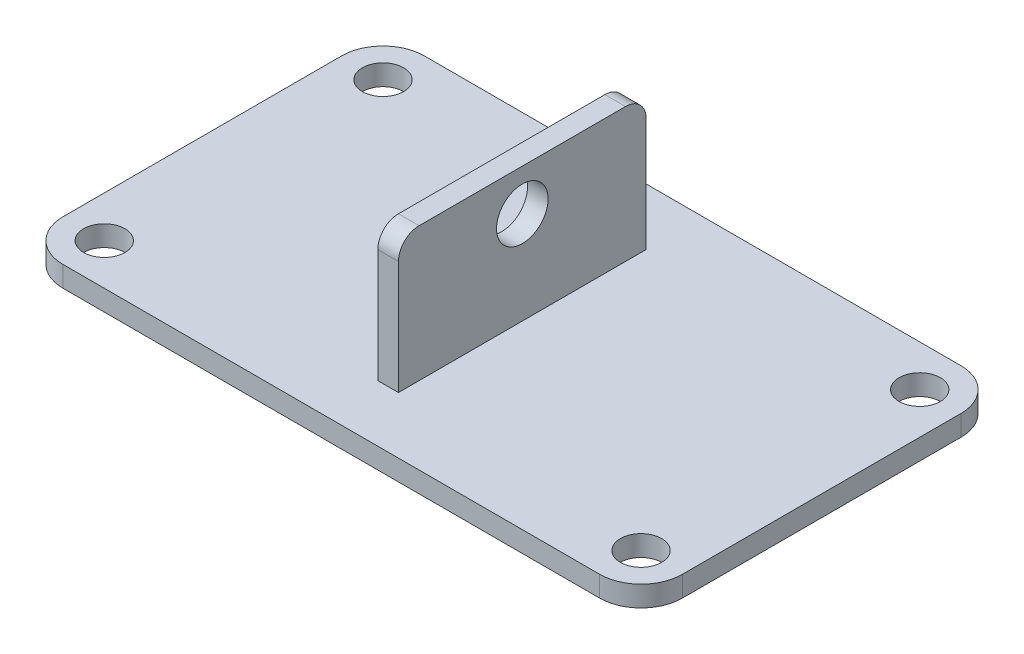
ISO-10303-21;
HEADER;
FILE_DESCRIPTION(('STEP AP214'),'2;1');
FILE_NAME('part.step','',(''),(''),'','','');
FILE_SCHEMA(('AUTOMOTIVE_DESIGN { 1 0 10303 214 1 1 1 1 }'));
ENDSEC;
DATA;
#1=APPLICATION_CONTEXT('core data for automotive mechanical design processes');
#2=APPLICATION_PROTOCOL_DEFINITION('international standard','automotive_design',2000,#1);
#3=PRODUCT_CONTEXT('',#1,'mechanical');
#4=PRODUCT('Part','Part','',(#3));
#5=PRODUCT_RELATED_PRODUCT_CATEGORY('part','',(#4));
#6=PRODUCT_DEFINITION_FORMATION('','',#4);
#7=PRODUCT_DEFINITION_CONTEXT('part definition',#1,'design');
#8=PRODUCT_DEFINITION('design','',#6,#7);
#9=PRODUCT_DEFINITION_SHAPE('','',#8);
#10=(LENGTH_UNIT() NAMED_UNIT(*) SI_UNIT(.MILLI.,.METRE.));
#11=(NAMED_UNIT(*) PLANE_ANGLE_UNIT() SI_UNIT($,.RADIAN.));
#12=(NAMED_UNIT(*) SI_UNIT($,.STERADIAN.) SOLID_ANGLE_UNIT());
#13=UNCERTAINTY_MEASURE_WITH_UNIT(LENGTH_MEASURE(1.E-05),#10,'distance_accuracy_value','');
#14=(GEOMETRIC_REPRESENTATION_CONTEXT(3) GLOBAL_UNCERTAINTY_ASSIGNED_CONTEXT((#13)) GLOBAL_UNIT_ASSIGNED_CONTEXT((#10,
#11,#12)) REPRESENTATION_CONTEXT('',''));
#15=CARTESIAN_POINT('',(0.,0.,0.));
#16=DIRECTION('',(0.,0.,1.));
#17=DIRECTION('',(1.,0.,0.));
#18=AXIS2_PLACEMENT_3D('',#15,#16,#17);
#19=CARTESIAN_POINT('',(5.,65.,-50.));
#20=DIRECTION('',(1.,0.,0.));
#21=DIRECTION('',(0.,0.,-1.));
#22=AXIS2_PLACEMENT_3D('',#19,#20,#21);
#23=PLANE('',#22);
#24=DIRECTION('',(0.,1.,0.));
#25=VECTOR('',#24,1.);
#26=CARTESIAN_POINT('',(5.,10.,-60.));
#27=LINE('',#26,#25);
#28=CARTESIAN_POINT('',(5.,10.,-60.));
#29=VERTEX_POINT('',#28);
#30=CARTESIAN_POINT('',(5.,65.,-60.));
#31=VERTEX_POINT('',#30);
#32=EDGE_CURVE('E153',#29,#31,#27,.T.);
#33=ORIENTED_EDGE('',*,*,#32,.T.);
#34=CARTESIAN_POINT('',(5.,65.,-50.));
#35=DIRECTION('',(1.,0.,0.));
#36=DIRECTION('',(0.,0.,-1.));
#37=AXIS2_PLACEMENT_3D('',#34,#35,#36);
#38=CIRCLE('',#37,10.);
#39=CARTESIAN_POINT('',(5.,75.,-50.));
#40=VERTEX_POINT('',#39);
#41=EDGE_CURVE('E111',#31,#40,#38,.T.);
#42=ORIENTED_EDGE('',*,*,#41,.T.);
#43=DIRECTION('',(0.,0.,1.));
#44=VECTOR('',#43,1.);
#45=CARTESIAN_POINT('',(5.,75.,50.));
#46=LINE('',#45,#44);
#47=CARTESIAN_POINT('',(5.,75.,50.));
#48=VERTEX_POINT('',#47);
#49=EDGE_CURVE('E124',#40,#48,#46,.T.);
#50=ORIENTED_EDGE('',*,*,#49,.T.);
#51=CARTESIAN_POINT('',(5.,65.,50.));
#52=DIRECTION('',(1.,0.,0.));
#53=DIRECTION('',(0.,0.,1.));
#54=AXIS2_PLACEMENT_3D('',#51,#52,#53);
#55=CIRCLE('',#54,10.);
#56=CARTESIAN_POINT('',(5.,65.,60.));
#57=VERTEX_POINT('',#56);
#58=EDGE_CURVE('E118',#48,#57,#55,.T.);
#59=ORIENTED_EDGE('',*,*,#58,.T.);
#60=DIRECTION('',(0.,-1.,0.));
#61=VECTOR('',#60,1.);
#62=CARTESIAN_POINT('',(5.,10.,60.));
#63=LINE('',#62,#61);
#64=CARTESIAN_POINT('',(5.,10.,60.));
#65=VERTEX_POINT('',#64);
#66=EDGE_CURVE('E122',#57,#65,#63,.T.);
#67=ORIENTED_EDGE('',*,*,#66,.T.);
#68=DIRECTION('',(0.,0.,-1.));
#69=VECTOR('',#68,1.);
#70=CARTESIAN_POINT('',(5.,10.,60.));
#71=LINE('',#70,#69);
#72=EDGE_CURVE('E74',#65,#29,#71,.T.);
#73=ORIENTED_EDGE('',*,*,#72,.T.);
#74=EDGE_LOOP('',(#33,#42,#50,#59,#67,#73));
#75=FACE_BOUND('',#74,.T.);
#76=CARTESIAN_POINT('',(5.,55.,0.));
#77=DIRECTION('',(1.,0.,0.));
#78=DIRECTION('',(0.,0.,-1.));
#79=AXIS2_PLACEMENT_3D('',#76,#77,#78);
#80=CIRCLE('',#79,12.5);
#81=CARTESIAN_POINT('',(5.,55.,-12.5));
#82=VERTEX_POINT('',#81);
#83=EDGE_CURVE('E146',#82,#82,#80,.T.);
#84=ORIENTED_EDGE('',*,*,#83,.F.);
#85=EDGE_LOOP('',(#84));
#86=FACE_BOUND('',#85,.T.);
#87=ADVANCED_FACE('F57',(#75,#86),#23,.T.);
#88=CARTESIAN_POINT('',(-5.,65.,-50.));
#89=DIRECTION('',(1.,0.,0.));
#90=DIRECTION('',(0.,0.,-1.));
#91=AXIS2_PLACEMENT_3D('',#88,#89,#90);
#92=PLANE('',#91);
#93=DIRECTION('',(0.,1.,0.));
#94=VECTOR('',#93,1.);
#95=CARTESIAN_POINT('',(-5.,10.,-60.));
#96=LINE('',#95,#94);
#97=CARTESIAN_POINT('',(-5.,10.,-60.));
#98=VERTEX_POINT('',#97);
#99=CARTESIAN_POINT('',(-5.,65.,-60.));
#100=VERTEX_POINT('',#99);
#101=EDGE_CURVE('E142',#98,#100,#96,.T.);
#102=ORIENTED_EDGE('',*,*,#101,.F.);
#103=DIRECTION('',(0.,0.,-1.));
#104=VECTOR('',#103,1.);
#105=CARTESIAN_POINT('',(-5.,10.,60.));
#106=LINE('',#105,#104);
#107=CARTESIAN_POINT('',(-5.,10.,60.));
#108=VERTEX_POINT('',#107);
#109=EDGE_CURVE('E103',#108,#98,#106,.T.);
#110=ORIENTED_EDGE('',*,*,#109,.F.);
#111=DIRECTION('',(0.,-1.,0.));
#112=VECTOR('',#111,1.);
#113=CARTESIAN_POINT('',(-5.,10.,60.));
#114=LINE('',#113,#112);
#115=CARTESIAN_POINT('',(-5.,65.,60.));
#116=VERTEX_POINT('',#115);
#117=EDGE_CURVE('E97',#116,#108,#114,.T.);
#118=ORIENTED_EDGE('',*,*,#117,.F.);
#119=CARTESIAN_POINT('',(-5.,65.,50.));
#120=DIRECTION('',(1.,0.,0.));
#121=DIRECTION('',(0.,0.,1.));
#122=AXIS2_PLACEMENT_3D('',#119,#120,#121);
#123=CIRCLE('',#122,10.);
#124=CARTESIAN_POINT('',(-5.,75.,50.));
#125=VERTEX_POINT('',#124);
#126=EDGE_CURVE('E132',#125,#116,#123,.T.);
#127=ORIENTED_EDGE('',*,*,#126,.F.);
#128=DIRECTION('',(0.,0.,1.));
#129=VECTOR('',#128,1.);
#130=CARTESIAN_POINT('',(-5.,75.,50.));
#131=LINE('',#130,#129);
#132=CARTESIAN_POINT('',(-5.,75.,-50.));
#133=VERTEX_POINT('',#132);
#134=EDGE_CURVE('E148',#133,#125,#131,.T.);
#135=ORIENTED_EDGE('',*,*,#134,.F.);
#136=CARTESIAN_POINT('',(-5.,65.,-50.));
#137=DIRECTION('',(1.,0.,0.));
#138=DIRECTION('',(0.,0.,-1.));
#139=AXIS2_PLACEMENT_3D('',#136,#137,#138);
#140=CIRCLE('',#139,10.);
#141=EDGE_CURVE('E145',#100,#133,#140,.T.);
#142=ORIENTED_EDGE('',*,*,#141,.F.);
#143=EDGE_LOOP('',(#102,#110,#118,#127,#135,#142));
#144=FACE_BOUND('',#143,.T.);
#145=CARTESIAN_POINT('',(-5.,55.,0.));
#146=DIRECTION('',(1.,0.,0.));
#147=DIRECTION('',(0.,0.,-1.));
#148=AXIS2_PLACEMENT_3D('',#145,#146,#147);
#149=CIRCLE('',#148,12.5);
#150=CARTESIAN_POINT('',(-5.,55.,-12.5));
#151=VERTEX_POINT('',#150);
#152=EDGE_CURVE('E246',#151,#151,#149,.T.);
#153=ORIENTED_EDGE('',*,*,#152,.T.);
#154=EDGE_LOOP('',(#153));
#155=FACE_BOUND('',#154,.T.);
#156=ADVANCED_FACE('F162',(#144,#155),#92,.F.);
#157=CARTESIAN_POINT('',(5.,10.,-60.));
#158=DIRECTION('',(0.,0.,1.));
#159=DIRECTION('',(1.,0.,0.));
#160=AXIS2_PLACEMENT_3D('',#157,#158,#159);
#161=PLANE('',#160);
#162=ORIENTED_EDGE('',*,*,#101,.T.);
#163=DIRECTION('',(-1.,0.,0.));
#164=VECTOR('',#163,1.);
#165=CARTESIAN_POINT('',(5.,65.,-60.));
#166=LINE('',#165,#164);
#167=EDGE_CURVE('E12',#31,#100,#166,.T.);
#168=ORIENTED_EDGE('',*,*,#167,.F.);
#169=ORIENTED_EDGE('',*,*,#32,.F.);
#170=DIRECTION('',(-1.,0.,0.));
#171=VECTOR('',#170,1.);
#172=CARTESIAN_POINT('',(5.,10.,-60.));
#173=LINE('',#172,#171);
#174=EDGE_CURVE('E138',#29,#98,#173,.T.);
#175=ORIENTED_EDGE('',*,*,#174,.T.);
#176=EDGE_LOOP('',(#162,#168,#169,#175));
#177=FACE_BOUND('',#176,.T.);
#178=ADVANCED_FACE('F59',(#177),#161,.F.);
#179=CARTESIAN_POINT('',(5.,65.,-50.));
#180=DIRECTION('',(-1.,0.,0.));
#181=DIRECTION('',(0.,0.,1.));
#182=AXIS2_PLACEMENT_3D('',#179,#180,#181);
#183=CYLINDRICAL_SURFACE('',#182,10.);
#184=ORIENTED_EDGE('',*,*,#141,.T.);
#185=DIRECTION('',(-1.,0.,0.));
#186=VECTOR('',#185,1.);
#187=CARTESIAN_POINT('',(5.,75.,-50.));
#188=LINE('',#187,#186);
#189=EDGE_CURVE('E66',#40,#133,#188,.T.);
#190=ORIENTED_EDGE('',*,*,#189,.F.);
#191=ORIENTED_EDGE('',*,*,#41,.F.);
#192=ORIENTED_EDGE('',*,*,#167,.T.);
#193=EDGE_LOOP('',(#184,#190,#191,#192));
#194=FACE_BOUND('',#193,.T.);
#195=ADVANCED_FACE('F187',(#194),#183,.T.);
#196=CARTESIAN_POINT('',(5.,75.,50.));
#197=DIRECTION('',(0.,-1.,0.));
#198=DIRECTION('',(0.,0.,-1.));
#199=AXIS2_PLACEMENT_3D('',#196,#197,#198);
#200=PLANE('',#199);
#201=ORIENTED_EDGE('',*,*,#134,.T.);
#202=DIRECTION('',(-1.,0.,0.));
#203=VECTOR('',#202,1.);
#204=CARTESIAN_POINT('',(5.,75.,50.));
#205=LINE('',#204,#203);
#206=EDGE_CURVE('E133',#48,#125,#205,.T.);
#207=ORIENTED_EDGE('',*,*,#206,.F.);
#208=ORIENTED_EDGE('',*,*,#49,.F.);
#209=ORIENTED_EDGE('',*,*,#189,.T.);
#210=EDGE_LOOP('',(#201,#207,#208,#209));
#211=FACE_BOUND('',#210,.T.);
#212=ADVANCED_FACE('F159',(#211),#200,.F.);
#213=CARTESIAN_POINT('',(5.,65.,50.));
#214=DIRECTION('',(-1.,0.,0.));
#215=DIRECTION('',(0.,0.,1.));
#216=AXIS2_PLACEMENT_3D('',#213,#214,#215);
#217=CYLINDRICAL_SURFACE('',#216,10.);
#218=ORIENTED_EDGE('',*,*,#126,.T.);
#219=DIRECTION('',(-1.,0.,0.));
#220=VECTOR('',#219,1.);
#221=CARTESIAN_POINT('',(5.,65.,60.));
#222=LINE('',#221,#220);
#223=EDGE_CURVE('E129',#57,#116,#222,.T.);
#224=ORIENTED_EDGE('',*,*,#223,.F.);
#225=ORIENTED_EDGE('',*,*,#58,.F.);
#226=ORIENTED_EDGE('',*,*,#206,.T.);
#227=EDGE_LOOP('',(#218,#224,#225,#226));
#228=FACE_BOUND('',#227,.T.);
#229=ADVANCED_FACE('F130',(#228),#217,.T.);
#230=CARTESIAN_POINT('',(5.,10.,60.));
#231=DIRECTION('',(0.,0.,-1.));
#232=DIRECTION('',(-1.,0.,0.));
#233=AXIS2_PLACEMENT_3D('',#230,#231,#232);
#234=PLANE('',#233);
#235=ORIENTED_EDGE('',*,*,#117,.T.);
#236=DIRECTION('',(-1.,0.,0.));
#237=VECTOR('',#236,1.);
#238=CARTESIAN_POINT('',(5.,10.,60.));
#239=LINE('',#238,#237);
#240=EDGE_CURVE('E134',#65,#108,#239,.T.);
#241=ORIENTED_EDGE('',*,*,#240,.F.);
#242=ORIENTED_EDGE('',*,*,#66,.F.);
#243=ORIENTED_EDGE('',*,*,#223,.T.);
#244=EDGE_LOOP('',(#235,#241,#242,#243));
#245=FACE_BOUND('',#244,.T.);
#246=ADVANCED_FACE('F136',(#245),#234,.F.);
#247=CARTESIAN_POINT('',(5.,10.,60.));
#248=DIRECTION('',(0.,1.,0.));
#249=DIRECTION('',(0.,0.,1.));
#250=AXIS2_PLACEMENT_3D('',#247,#248,#249);
#251=PLANE('',#250);
#252=ORIENTED_EDGE('',*,*,#109,.T.);
#253=ORIENTED_EDGE('',*,*,#174,.F.);
#254=ORIENTED_EDGE('',*,*,#72,.F.);
#255=ORIENTED_EDGE('',*,*,#240,.T.);
#256=EDGE_LOOP('',(#252,#253,#254,#255));
#257=FACE_BOUND('',#256,.T.);
#258=ADVANCED_FACE('F167',(#257),#251,.F.);
#259=CARTESIAN_POINT('',(5.,55.,0.));
#260=DIRECTION('',(-1.,0.,0.));
#261=DIRECTION('',(0.,0.,1.));
#262=AXIS2_PLACEMENT_3D('',#259,#260,#261);
#263=CYLINDRICAL_SURFACE('',#262,12.5);
#264=ORIENTED_EDGE('',*,*,#83,.T.);
#265=EDGE_LOOP('',(#264));
#266=FACE_BOUND('',#265,.T.);
#267=ORIENTED_EDGE('',*,*,#152,.F.);
#268=EDGE_LOOP('',(#267));
#269=FACE_BOUND('',#268,.T.);
#270=ADVANCED_FACE('F169',(#266,#269),#263,.F.);
#271=CLOSED_SHELL('',(#87,#156,#178,#195,#212,#229,#246,#258,#270));
#272=MANIFOLD_SOLID_BREP('B2',#271);
#273=CARTESIAN_POINT('',(130.,10.,-67.5));
#274=DIRECTION('',(0.,1.,0.));
#275=DIRECTION('',(0.,0.,1.));
#276=AXIS2_PLACEMENT_3D('',#273,#274,#275);
#277=PLANE('',#276);
#278=CARTESIAN_POINT('',(130.,10.,-67.5));
#279=DIRECTION('',(0.,1.,0.));
#280=DIRECTION('',(0.,0.,-1.));
#281=AXIS2_PLACEMENT_3D('',#278,#279,#280);
#282=CIRCLE('',#281,9.99999999999998);
#283=CARTESIAN_POINT('',(130.,10.,-77.5));
#284=VERTEX_POINT('',#283);
#285=EDGE_CURVE('E436',#284,#284,#282,.T.);
#286=ORIENTED_EDGE('',*,*,#285,.F.);
#287=EDGE_LOOP('',(#286));
#288=FACE_BOUND('',#287,.T.);
#289=CARTESIAN_POINT('',(-130.,10.,-67.5));
#290=DIRECTION('',(0.,1.,0.));
#291=DIRECTION('',(0.,0.,1.));
#292=AXIS2_PLACEMENT_3D('',#289,#290,#291);
#293=CIRCLE('',#292,9.99999999999999);
#294=CARTESIAN_POINT('',(-130.,10.,-57.5));
#295=VERTEX_POINT('',#294);
#296=EDGE_CURVE('E361',#295,#295,#293,.T.);
#297=ORIENTED_EDGE('',*,*,#296,.F.);
#298=EDGE_LOOP('',(#297));
#299=FACE_BOUND('',#298,.T.);
#300=CARTESIAN_POINT('',(130.,10.,-67.5));
#301=DIRECTION('',(0.,1.,0.));
#302=DIRECTION('',(0.,0.,1.));
#303=AXIS2_PLACEMENT_3D('',#300,#301,#302);
#304=CIRCLE('',#303,20.);
#305=CARTESIAN_POINT('',(150.,10.,-67.5));
#306=VERTEX_POINT('',#305);
#307=CARTESIAN_POINT('',(130.,10.,-87.5));
#308=VERTEX_POINT('',#307);
#309=EDGE_CURVE('E379',#306,#308,#304,.T.);
#310=ORIENTED_EDGE('',*,*,#309,.T.);
#311=DIRECTION('',(-1.,0.,0.));
#312=VECTOR('',#311,1.);
#313=CARTESIAN_POINT('',(-130.,10.,-87.5));
#314=LINE('',#313,#312);
#315=CARTESIAN_POINT('',(-130.,10.,-87.5));
#316=VERTEX_POINT('',#315);
#317=EDGE_CURVE('E315',#308,#316,#314,.T.);
#318=ORIENTED_EDGE('',*,*,#317,.T.);
#319=CARTESIAN_POINT('',(-130.,10.,-67.5));
#320=DIRECTION('',(0.,1.,0.));
#321=DIRECTION('',(0.,0.,-1.));
#322=AXIS2_PLACEMENT_3D('',#319,#320,#321);
#323=CIRCLE('',#322,20.);
#324=CARTESIAN_POINT('',(-150.,10.,-67.5));
#325=VERTEX_POINT('',#324);
#326=EDGE_CURVE('E400',#316,#325,#323,.T.);
#327=ORIENTED_EDGE('',*,*,#326,.T.);
#328=DIRECTION('',(0.,0.,1.));
#329=VECTOR('',#328,1.);
#330=CARTESIAN_POINT('',(-150.,10.,67.5));
#331=LINE('',#330,#329);
#332=CARTESIAN_POINT('',(-150.,10.,67.5));
#333=VERTEX_POINT('',#332);
#334=EDGE_CURVE('E414',#325,#333,#331,.T.);
#335=ORIENTED_EDGE('',*,*,#334,.T.);
#336=CARTESIAN_POINT('',(-130.,10.,67.5));
#337=DIRECTION('',(0.,1.,0.));
#338=DIRECTION('',(0.,0.,-1.));
#339=AXIS2_PLACEMENT_3D('',#336,#337,#338);
#340=CIRCLE('',#339,20.);
#341=CARTESIAN_POINT('',(-130.,10.,87.5));
#342=VERTEX_POINT('',#341);
#343=EDGE_CURVE('E334',#333,#342,#340,.T.);
#344=ORIENTED_EDGE('',*,*,#343,.T.);
#345=DIRECTION('',(1.,0.,0.));
#346=VECTOR('',#345,1.);
#347=CARTESIAN_POINT('',(-130.,10.,87.5));
#348=LINE('',#347,#346);
#349=CARTESIAN_POINT('',(130.,10.,87.5));
#350=VERTEX_POINT('',#349);
#351=EDGE_CURVE('E328',#342,#350,#348,.T.);
#352=ORIENTED_EDGE('',*,*,#351,.T.);
#353=CARTESIAN_POINT('',(130.,10.,67.5));
#354=DIRECTION('',(0.,1.,0.));
#355=DIRECTION('',(0.,0.,-1.));
#356=AXIS2_PLACEMENT_3D('',#353,#354,#355);
#357=CIRCLE('',#356,20.);
#358=CARTESIAN_POINT('',(150.,10.,67.5));
#359=VERTEX_POINT('',#358);
#360=EDGE_CURVE('E332',#350,#359,#357,.T.);
#361=ORIENTED_EDGE('',*,*,#360,.T.);
#362=DIRECTION('',(0.,0.,-1.));
#363=VECTOR('',#362,1.);
#364=CARTESIAN_POINT('',(150.,10.,67.5));
#365=LINE('',#364,#363);
#366=EDGE_CURVE('E272',#359,#306,#365,.T.);
#367=ORIENTED_EDGE('',*,*,#366,.T.);
#368=EDGE_LOOP('',(#310,#318,#327,#335,#344,#352,#361,#367));
#369=FACE_BOUND('',#368,.T.);
#370=CARTESIAN_POINT('',(-130.,10.,67.5));
#371=DIRECTION('',(0.,1.,0.));
#372=DIRECTION('',(0.,0.,-1.));
#373=AXIS2_PLACEMENT_3D('',#370,#371,#372);
#374=CIRCLE('',#373,9.99999999999999);
#375=CARTESIAN_POINT('',(-130.,10.,57.5));
#376=VERTEX_POINT('',#375);
#377=EDGE_CURVE('E428',#376,#376,#374,.T.);
#378=ORIENTED_EDGE('',*,*,#377,.F.);
#379=EDGE_LOOP('',(#378));
#380=FACE_BOUND('',#379,.T.);
#381=CARTESIAN_POINT('',(130.,10.,67.5));
#382=DIRECTION('',(0.,1.,0.));
#383=DIRECTION('',(0.,0.,1.));
#384=AXIS2_PLACEMENT_3D('',#381,#382,#383);
#385=CIRCLE('',#384,9.99999999999998);
#386=CARTESIAN_POINT('',(130.,10.,77.5));
#387=VERTEX_POINT('',#386);
#388=EDGE_CURVE('E444',#387,#387,#385,.T.);
#389=ORIENTED_EDGE('',*,*,#388,.F.);
#390=EDGE_LOOP('',(#389));
#391=FACE_BOUND('',#390,.T.);
#392=ADVANCED_FACE('F254',(#288,#299,#369,#380,#391),#277,.T.);
#393=CARTESIAN_POINT('',(130.,0.,-67.5));
#394=DIRECTION('',(0.,1.,0.));
#395=DIRECTION('',(0.,0.,1.));
#396=AXIS2_PLACEMENT_3D('',#393,#394,#395);
#397=PLANE('',#396);
#398=CARTESIAN_POINT('',(130.,0.,-67.5));
#399=DIRECTION('',(0.,1.,0.));
#400=DIRECTION('',(0.,0.,1.));
#401=AXIS2_PLACEMENT_3D('',#398,#399,#400);
#402=CIRCLE('',#401,20.);
#403=CARTESIAN_POINT('',(150.,0.,-67.5));
#404=VERTEX_POINT('',#403);
#405=CARTESIAN_POINT('',(130.,0.,-87.5));
#406=VERTEX_POINT('',#405);
#407=EDGE_CURVE('E356',#404,#406,#402,.T.);
#408=ORIENTED_EDGE('',*,*,#407,.F.);
#409=DIRECTION('',(0.,0.,-1.));
#410=VECTOR('',#409,1.);
#411=CARTESIAN_POINT('',(150.,0.,67.5));
#412=LINE('',#411,#410);
#413=CARTESIAN_POINT('',(150.,0.,67.5));
#414=VERTEX_POINT('',#413);
#415=EDGE_CURVE('E307',#414,#404,#412,.T.);
#416=ORIENTED_EDGE('',*,*,#415,.F.);
#417=CARTESIAN_POINT('',(130.,0.,67.5));
#418=DIRECTION('',(0.,1.,0.));
#419=DIRECTION('',(0.,0.,-1.));
#420=AXIS2_PLACEMENT_3D('',#417,#418,#419);
#421=CIRCLE('',#420,20.);
#422=CARTESIAN_POINT('',(130.,0.,87.5));
#423=VERTEX_POINT('',#422);
#424=EDGE_CURVE('E301',#423,#414,#421,.T.);
#425=ORIENTED_EDGE('',*,*,#424,.F.);
#426=DIRECTION('',(1.,0.,0.));
#427=VECTOR('',#426,1.);
#428=CARTESIAN_POINT('',(-130.,0.,87.5));
#429=LINE('',#428,#427);
#430=CARTESIAN_POINT('',(-130.,0.,87.5));
#431=VERTEX_POINT('',#430);
#432=EDGE_CURVE('E343',#431,#423,#429,.T.);
#433=ORIENTED_EDGE('',*,*,#432,.F.);
#434=CARTESIAN_POINT('',(-130.,0.,67.5));
#435=DIRECTION('',(0.,1.,0.));
#436=DIRECTION('',(0.,0.,-1.));
#437=AXIS2_PLACEMENT_3D('',#434,#435,#436);
#438=CIRCLE('',#437,20.);
#439=CARTESIAN_POINT('',(-150.,0.,67.5));
#440=VERTEX_POINT('',#439);
#441=EDGE_CURVE('E370',#440,#431,#438,.T.);
#442=ORIENTED_EDGE('',*,*,#441,.F.);
#443=DIRECTION('',(0.,0.,1.));
#444=VECTOR('',#443,1.);
#445=CARTESIAN_POINT('',(-150.,0.,67.5));
#446=LINE('',#445,#444);
#447=CARTESIAN_POINT('',(-150.,0.,-67.5));
#448=VERTEX_POINT('',#447);
#449=EDGE_CURVE('E367',#448,#440,#446,.T.);
#450=ORIENTED_EDGE('',*,*,#449,.F.);
#451=CARTESIAN_POINT('',(-130.,0.,-67.5));
#452=DIRECTION('',(0.,1.,0.));
#453=DIRECTION('',(0.,0.,-1.));
#454=AXIS2_PLACEMENT_3D('',#451,#452,#453);
#455=CIRCLE('',#454,20.);
#456=CARTESIAN_POINT('',(-130.,0.,-87.5));
#457=VERTEX_POINT('',#456);
#458=EDGE_CURVE('E364',#457,#448,#455,.T.);
#459=ORIENTED_EDGE('',*,*,#458,.F.);
#460=DIRECTION('',(-1.,0.,0.));
#461=VECTOR('',#460,1.);
#462=CARTESIAN_POINT('',(-130.,0.,-87.5));
#463=LINE('',#462,#461);
#464=EDGE_CURVE('E360',#406,#457,#463,.T.);
#465=ORIENTED_EDGE('',*,*,#464,.F.);
#466=EDGE_LOOP('',(#408,#416,#425,#433,#442,#450,#459,#465));
#467=FACE_BOUND('',#466,.T.);
#468=CARTESIAN_POINT('',(-130.,0.,-67.5));
#469=DIRECTION('',(0.,1.,0.));
#470=DIRECTION('',(0.,0.,1.));
#471=AXIS2_PLACEMENT_3D('',#468,#469,#470);
#472=CIRCLE('',#471,9.99999999999999);
#473=CARTESIAN_POINT('',(-130.,0.,-57.5));
#474=VERTEX_POINT('',#473);
#475=EDGE_CURVE('E424',#474,#474,#472,.T.);
#476=ORIENTED_EDGE('',*,*,#475,.T.);
#477=EDGE_LOOP('',(#476));
#478=FACE_BOUND('',#477,.T.);
#479=CARTESIAN_POINT('',(-130.,0.,67.5));
#480=DIRECTION('',(0.,1.,0.));
#481=DIRECTION('',(0.,0.,-1.));
#482=AXIS2_PLACEMENT_3D('',#479,#480,#481);
#483=CIRCLE('',#482,9.99999999999999);
#484=CARTESIAN_POINT('',(-130.,0.,57.5));
#485=VERTEX_POINT('',#484);
#486=EDGE_CURVE('E432',#485,#485,#483,.T.);
#487=ORIENTED_EDGE('',*,*,#486,.T.);
#488=EDGE_LOOP('',(#487));
#489=FACE_BOUND('',#488,.T.);
#490=CARTESIAN_POINT('',(130.,0.,-67.5));
#491=DIRECTION('',(0.,1.,0.));
#492=DIRECTION('',(0.,0.,-1.));
#493=AXIS2_PLACEMENT_3D('',#490,#491,#492);
#494=CIRCLE('',#493,9.99999999999998);
#495=CARTESIAN_POINT('',(130.,0.,-77.5));
#496=VERTEX_POINT('',#495);
#497=EDGE_CURVE('E440',#496,#496,#494,.T.);
#498=ORIENTED_EDGE('',*,*,#497,.T.);
#499=EDGE_LOOP('',(#498));
#500=FACE_BOUND('',#499,.T.);
#501=CARTESIAN_POINT('',(130.,0.,67.5));
#502=DIRECTION('',(0.,1.,0.));
#503=DIRECTION('',(0.,0.,1.));
#504=AXIS2_PLACEMENT_3D('',#501,#502,#503);
#505=CIRCLE('',#504,9.99999999999998);
#506=CARTESIAN_POINT('',(130.,0.,77.5));
#507=VERTEX_POINT('',#506);
#508=EDGE_CURVE('E448',#507,#507,#505,.T.);
#509=ORIENTED_EDGE('',*,*,#508,.T.);
#510=EDGE_LOOP('',(#509));
#511=FACE_BOUND('',#510,.T.);
#512=ADVANCED_FACE('F404',(#467,#478,#489,#500,#511),#397,.F.);
#513=CARTESIAN_POINT('',(130.,10.,-67.5));
#514=DIRECTION('',(0.,-1.,0.));
#515=DIRECTION('',(0.,0.,-1.));
#516=AXIS2_PLACEMENT_3D('',#513,#514,#515);
#517=CYLINDRICAL_SURFACE('',#516,20.);
#518=ORIENTED_EDGE('',*,*,#407,.T.);
#519=DIRECTION('',(0.,-1.,0.));
#520=VECTOR('',#519,1.);
#521=CARTESIAN_POINT('',(130.,10.,-87.5));
#522=LINE('',#521,#520);
#523=EDGE_CURVE('E55',#308,#406,#522,.T.);
#524=ORIENTED_EDGE('',*,*,#523,.F.);
#525=ORIENTED_EDGE('',*,*,#309,.F.);
#526=DIRECTION('',(0.,-1.,0.));
#527=VECTOR('',#526,1.);
#528=CARTESIAN_POINT('',(150.,10.,-67.5));
#529=LINE('',#528,#527);
#530=EDGE_CURVE('E352',#306,#404,#529,.T.);
#531=ORIENTED_EDGE('',*,*,#530,.T.);
#532=EDGE_LOOP('',(#518,#524,#525,#531));
#533=FACE_BOUND('',#532,.T.);
#534=ADVANCED_FACE('F256',(#533),#517,.T.);
#535=CARTESIAN_POINT('',(-130.,10.,-87.5));
#536=DIRECTION('',(0.,0.,1.));
#537=DIRECTION('',(1.,0.,0.));
#538=AXIS2_PLACEMENT_3D('',#535,#536,#537);
#539=PLANE('',#538);
#540=ORIENTED_EDGE('',*,*,#464,.T.);
#541=DIRECTION('',(0.,-1.,0.));
#542=VECTOR('',#541,1.);
#543=CARTESIAN_POINT('',(-130.,10.,-87.5));
#544=LINE('',#543,#542);
#545=EDGE_CURVE('E264',#316,#457,#544,.T.);
#546=ORIENTED_EDGE('',*,*,#545,.F.);
#547=ORIENTED_EDGE('',*,*,#317,.F.);
#548=ORIENTED_EDGE('',*,*,#523,.T.);
#549=EDGE_LOOP('',(#540,#546,#547,#548));
#550=FACE_BOUND('',#549,.T.);
#551=ADVANCED_FACE('F484',(#550),#539,.F.);
#552=CARTESIAN_POINT('',(-130.,10.,-67.5));
#553=DIRECTION('',(0.,-1.,0.));
#554=DIRECTION('',(0.,0.,-1.));
#555=AXIS2_PLACEMENT_3D('',#552,#553,#554);
#556=CYLINDRICAL_SURFACE('',#555,20.);
#557=ORIENTED_EDGE('',*,*,#458,.T.);
#558=DIRECTION('',(0.,-1.,0.));
#559=VECTOR('',#558,1.);
#560=CARTESIAN_POINT('',(-150.,10.,-67.5));
#561=LINE('',#560,#559);
#562=EDGE_CURVE('E390',#325,#448,#561,.T.);
#563=ORIENTED_EDGE('',*,*,#562,.F.);
#564=ORIENTED_EDGE('',*,*,#326,.F.);
#565=ORIENTED_EDGE('',*,*,#545,.T.);
#566=EDGE_LOOP('',(#557,#563,#564,#565));
#567=FACE_BOUND('',#566,.T.);
#568=ADVANCED_FACE('F398',(#567),#556,.T.);
#569=CARTESIAN_POINT('',(-150.,10.,67.5));
#570=DIRECTION('',(1.,0.,0.));
#571=DIRECTION('',(0.,0.,-1.));
#572=AXIS2_PLACEMENT_3D('',#569,#570,#571);
#573=PLANE('',#572);
#574=ORIENTED_EDGE('',*,*,#449,.T.);
#575=DIRECTION('',(0.,-1.,0.));
#576=VECTOR('',#575,1.);
#577=CARTESIAN_POINT('',(-150.,10.,67.5));
#578=LINE('',#577,#576);
#579=EDGE_CURVE('E386',#333,#440,#578,.T.);
#580=ORIENTED_EDGE('',*,*,#579,.F.);
#581=ORIENTED_EDGE('',*,*,#334,.F.);
#582=ORIENTED_EDGE('',*,*,#562,.T.);
#583=EDGE_LOOP('',(#574,#580,#581,#582));
#584=FACE_BOUND('',#583,.T.);
#585=ADVANCED_FACE('F409',(#584),#573,.F.);
#586=CARTESIAN_POINT('',(-130.,10.,67.5));
#587=DIRECTION('',(0.,-1.,0.));
#588=DIRECTION('',(0.,0.,-1.));
#589=AXIS2_PLACEMENT_3D('',#586,#587,#588);
#590=CYLINDRICAL_SURFACE('',#589,20.);
#591=ORIENTED_EDGE('',*,*,#441,.T.);
#592=DIRECTION('',(0.,-1.,0.));
#593=VECTOR('',#592,1.);
#594=CARTESIAN_POINT('',(-130.,10.,87.5));
#595=LINE('',#594,#593);
#596=EDGE_CURVE('E345',#342,#431,#595,.T.);
#597=ORIENTED_EDGE('',*,*,#596,.F.);
#598=ORIENTED_EDGE('',*,*,#343,.F.);
#599=ORIENTED_EDGE('',*,*,#579,.T.);
#600=EDGE_LOOP('',(#591,#597,#598,#599));
#601=FACE_BOUND('',#600,.T.);
#602=ADVANCED_FACE('F412',(#601),#590,.T.);
#603=CARTESIAN_POINT('',(-130.,10.,87.5));
#604=DIRECTION('',(0.,0.,-1.));
#605=DIRECTION('',(-1.,0.,0.));
#606=AXIS2_PLACEMENT_3D('',#603,#604,#605);
#607=PLANE('',#606);
#608=ORIENTED_EDGE('',*,*,#432,.T.);
#609=DIRECTION('',(0.,-1.,0.));
#610=VECTOR('',#609,1.);
#611=CARTESIAN_POINT('',(130.,10.,87.5));
#612=LINE('',#611,#610);
#613=EDGE_CURVE('E340',#350,#423,#612,.T.);
#614=ORIENTED_EDGE('',*,*,#613,.F.);
#615=ORIENTED_EDGE('',*,*,#351,.F.);
#616=ORIENTED_EDGE('',*,*,#596,.T.);
#617=EDGE_LOOP('',(#608,#614,#615,#616));
#618=FACE_BOUND('',#617,.T.);
#619=ADVANCED_FACE('F341',(#618),#607,.F.);
#620=CARTESIAN_POINT('',(130.,10.,67.5));
#621=DIRECTION('',(0.,-1.,0.));
#622=DIRECTION('',(0.,0.,-1.));
#623=AXIS2_PLACEMENT_3D('',#620,#621,#622);
#624=CYLINDRICAL_SURFACE('',#623,20.);
#625=ORIENTED_EDGE('',*,*,#424,.T.);
#626=DIRECTION('',(0.,-1.,0.));
#627=VECTOR('',#626,1.);
#628=CARTESIAN_POINT('',(150.,10.,67.5));
#629=LINE('',#628,#627);
#630=EDGE_CURVE('E346',#359,#414,#629,.T.);
#631=ORIENTED_EDGE('',*,*,#630,.F.);
#632=ORIENTED_EDGE('',*,*,#360,.F.);
#633=ORIENTED_EDGE('',*,*,#613,.T.);
#634=EDGE_LOOP('',(#625,#631,#632,#633));
#635=FACE_BOUND('',#634,.T.);
#636=ADVANCED_FACE('F348',(#635),#624,.T.);
#637=CARTESIAN_POINT('',(150.,10.,67.5));
#638=DIRECTION('',(-1.,0.,0.));
#639=DIRECTION('',(0.,0.,1.));
#640=AXIS2_PLACEMENT_3D('',#637,#638,#639);
#641=PLANE('',#640);
#642=ORIENTED_EDGE('',*,*,#415,.T.);
#643=ORIENTED_EDGE('',*,*,#530,.F.);
#644=ORIENTED_EDGE('',*,*,#366,.F.);
#645=ORIENTED_EDGE('',*,*,#630,.T.);
#646=EDGE_LOOP('',(#642,#643,#644,#645));
#647=FACE_BOUND('',#646,.T.);
#648=ADVANCED_FACE('F472',(#647),#641,.F.);
#649=CARTESIAN_POINT('',(-130.,10.,-67.5));
#650=DIRECTION('',(0.,-1.,0.));
#651=DIRECTION('',(0.,0.,-1.));
#652=AXIS2_PLACEMENT_3D('',#649,#650,#651);
#653=CYLINDRICAL_SURFACE('',#652,9.99999999999999);
#654=ORIENTED_EDGE('',*,*,#296,.T.);
#655=EDGE_LOOP('',(#654));
#656=FACE_BOUND('',#655,.T.);
#657=ORIENTED_EDGE('',*,*,#475,.F.);
#658=EDGE_LOOP('',(#657));
#659=FACE_BOUND('',#658,.T.);
#660=ADVANCED_FACE('F469',(#656,#659),#653,.F.);
#661=CARTESIAN_POINT('',(-130.,10.,67.5));
#662=DIRECTION('',(0.,-1.,0.));
#663=DIRECTION('',(0.,0.,-1.));
#664=AXIS2_PLACEMENT_3D('',#661,#662,#663);
#665=CYLINDRICAL_SURFACE('',#664,9.99999999999999);
#666=ORIENTED_EDGE('',*,*,#377,.T.);
#667=EDGE_LOOP('',(#666));
#668=FACE_BOUND('',#667,.T.);
#669=ORIENTED_EDGE('',*,*,#486,.F.);
#670=EDGE_LOOP('',(#669));
#671=FACE_BOUND('',#670,.T.);
#672=ADVANCED_FACE('F547',(#668,#671),#665,.F.);
#673=CARTESIAN_POINT('',(130.,10.,-67.5));
#674=DIRECTION('',(0.,-1.,0.));
#675=DIRECTION('',(0.,0.,-1.));
#676=AXIS2_PLACEMENT_3D('',#673,#674,#675);
#677=CYLINDRICAL_SURFACE('',#676,9.99999999999998);
#678=ORIENTED_EDGE('',*,*,#285,.T.);
#679=EDGE_LOOP('',(#678));
#680=FACE_BOUND('',#679,.T.);
#681=ORIENTED_EDGE('',*,*,#497,.F.);
#682=EDGE_LOOP('',(#681));
#683=FACE_BOUND('',#682,.T.);
#684=ADVANCED_FACE('F555',(#680,#683),#677,.F.);
#685=CARTESIAN_POINT('',(130.,10.,67.5));
#686=DIRECTION('',(0.,-1.,0.));
#687=DIRECTION('',(0.,0.,-1.));
#688=AXIS2_PLACEMENT_3D('',#685,#686,#687);
#689=CYLINDRICAL_SURFACE('',#688,9.99999999999998);
#690=ORIENTED_EDGE('',*,*,#388,.T.);
#691=EDGE_LOOP('',(#690));
#692=FACE_BOUND('',#691,.T.);
#693=ORIENTED_EDGE('',*,*,#508,.F.);
#694=EDGE_LOOP('',(#693));
#695=FACE_BOUND('',#694,.T.);
#696=ADVANCED_FACE('F456',(#692,#695),#689,.F.);
#697=CLOSED_SHELL('',(#392,#512,#534,#551,#568,#585,#602,#619,#636,#648,#660,#672,#684,#696));
#698=MANIFOLD_SOLID_BREP('B6',#697);
#699=ADVANCED_BREP_SHAPE_REPRESENTATION('',(#18,#272,#698),#14);
#700=SHAPE_DEFINITION_REPRESENTATION(#9,#699);
ENDSEC;
END-ISO-10303-21;
